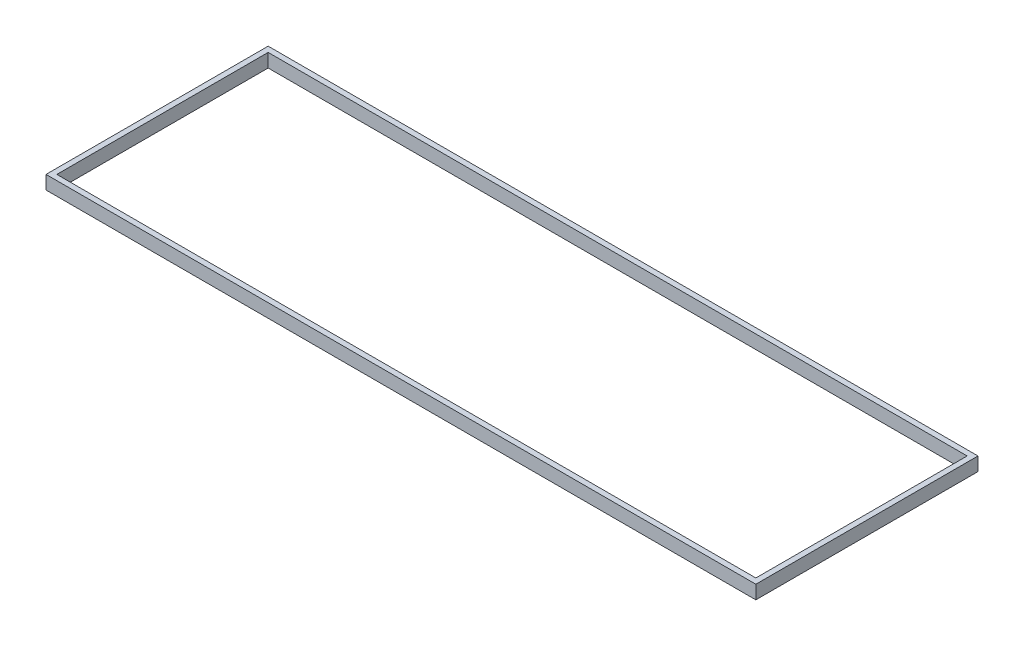
ISO-10303-21;
HEADER;
FILE_DESCRIPTION(('STEP AP214'),'2;1');
FILE_NAME('part.step','',(''),(''),'','','');
FILE_SCHEMA(('AUTOMOTIVE_DESIGN { 1 0 10303 214 1 1 1 1 }'));
ENDSEC;
DATA;
#1=APPLICATION_CONTEXT('core data for automotive mechanical design processes');
#2=APPLICATION_PROTOCOL_DEFINITION('international standard','automotive_design',2000,#1);
#3=PRODUCT_CONTEXT('',#1,'mechanical');
#4=PRODUCT('Part','Part','',(#3));
#5=PRODUCT_RELATED_PRODUCT_CATEGORY('part','',(#4));
#6=PRODUCT_DEFINITION_FORMATION('','',#4);
#7=PRODUCT_DEFINITION_CONTEXT('part definition',#1,'design');
#8=PRODUCT_DEFINITION('design','',#6,#7);
#9=PRODUCT_DEFINITION_SHAPE('','',#8);
#10=(LENGTH_UNIT() NAMED_UNIT(*) SI_UNIT(.MILLI.,.METRE.));
#11=(NAMED_UNIT(*) PLANE_ANGLE_UNIT() SI_UNIT($,.RADIAN.));
#12=(NAMED_UNIT(*) SI_UNIT($,.STERADIAN.) SOLID_ANGLE_UNIT());
#13=UNCERTAINTY_MEASURE_WITH_UNIT(LENGTH_MEASURE(1.E-05),#10,'distance_accuracy_value','');
#14=(GEOMETRIC_REPRESENTATION_CONTEXT(3) GLOBAL_UNCERTAINTY_ASSIGNED_CONTEXT((#13)) GLOBAL_UNIT_ASSIGNED_CONTEXT((#10,
#11,#12)) REPRESENTATION_CONTEXT('',''));
#15=CARTESIAN_POINT('',(0.,0.,0.));
#16=DIRECTION('',(0.,0.,1.));
#17=DIRECTION('',(1.,0.,0.));
#18=AXIS2_PLACEMENT_3D('',#15,#16,#17);
#19=CARTESIAN_POINT('',(0.,5.,0.));
#20=DIRECTION('',(0.,-1.,0.));
#21=DIRECTION('',(0.,0.,-1.));
#22=AXIS2_PLACEMENT_3D('',#19,#20,#21);
#23=PLANE('',#22);
#24=DIRECTION('',(0.,0.,1.));
#25=VECTOR('',#24,1.);
#26=CARTESIAN_POINT('',(0.,5.,0.));
#27=LINE('',#26,#25);
#28=CARTESIAN_POINT('',(0.,5.,-82.));
#29=VERTEX_POINT('',#28);
#30=CARTESIAN_POINT('',(0.,5.,0.));
#31=VERTEX_POINT('',#30);
#32=EDGE_CURVE('E134',#29,#31,#27,.T.);
#33=ORIENTED_EDGE('',*,*,#32,.T.);
#34=DIRECTION('',(1.,0.,0.));
#35=VECTOR('',#34,1.);
#36=CARTESIAN_POINT('',(0.,5.,0.));
#37=LINE('',#36,#35);
#38=CARTESIAN_POINT('',(262.,5.,0.));
#39=VERTEX_POINT('',#38);
#40=EDGE_CURVE('E137',#31,#39,#37,.T.);
#41=ORIENTED_EDGE('',*,*,#40,.T.);
#42=DIRECTION('',(0.,0.,-1.));
#43=VECTOR('',#42,1.);
#44=CARTESIAN_POINT('',(262.,5.,0.));
#45=LINE('',#44,#43);
#46=CARTESIAN_POINT('',(262.,5.,-82.));
#47=VERTEX_POINT('',#46);
#48=EDGE_CURVE('E140',#39,#47,#45,.T.);
#49=ORIENTED_EDGE('',*,*,#48,.T.);
#50=DIRECTION('',(-1.,0.,0.));
#51=VECTOR('',#50,1.);
#52=CARTESIAN_POINT('',(0.,5.,-82.));
#53=LINE('',#52,#51);
#54=EDGE_CURVE('E142',#47,#29,#53,.T.);
#55=ORIENTED_EDGE('',*,*,#54,.T.);
#56=EDGE_LOOP('',(#33,#41,#49,#55));
#57=FACE_BOUND('',#56,.T.);
#58=DIRECTION('',(0.,0.,1.));
#59=VECTOR('',#58,1.);
#60=CARTESIAN_POINT('',(2.,5.,-2.));
#61=LINE('',#60,#59);
#62=CARTESIAN_POINT('',(2.,5.,-80.));
#63=VERTEX_POINT('',#62);
#64=CARTESIAN_POINT('',(2.,5.,-2.));
#65=VERTEX_POINT('',#64);
#66=EDGE_CURVE('E98',#63,#65,#61,.T.);
#67=ORIENTED_EDGE('',*,*,#66,.F.);
#68=DIRECTION('',(-1.,0.,0.));
#69=VECTOR('',#68,1.);
#70=CARTESIAN_POINT('',(2.,5.,-80.));
#71=LINE('',#70,#69);
#72=CARTESIAN_POINT('',(260.,5.,-80.));
#73=VERTEX_POINT('',#72);
#74=EDGE_CURVE('E120',#73,#63,#71,.T.);
#75=ORIENTED_EDGE('',*,*,#74,.F.);
#76=DIRECTION('',(0.,0.,-1.));
#77=VECTOR('',#76,1.);
#78=CARTESIAN_POINT('',(260.,5.,-2.));
#79=LINE('',#78,#77);
#80=CARTESIAN_POINT('',(260.,5.,-2.));
#81=VERTEX_POINT('',#80);
#82=EDGE_CURVE('E118',#81,#73,#79,.T.);
#83=ORIENTED_EDGE('',*,*,#82,.F.);
#84=DIRECTION('',(1.,0.,0.));
#85=VECTOR('',#84,1.);
#86=CARTESIAN_POINT('',(2.,5.,-2.));
#87=LINE('',#86,#85);
#88=EDGE_CURVE('E106',#65,#81,#87,.T.);
#89=ORIENTED_EDGE('',*,*,#88,.F.);
#90=EDGE_LOOP('',(#67,#75,#83,#89));
#91=FACE_BOUND('',#90,.T.);
#92=ADVANCED_FACE('F33',(#57,#91),#23,.F.);
#93=CARTESIAN_POINT('',(0.,0.,0.));
#94=DIRECTION('',(0.,-1.,0.));
#95=DIRECTION('',(0.,0.,-1.));
#96=AXIS2_PLACEMENT_3D('',#93,#94,#95);
#97=PLANE('',#96);
#98=DIRECTION('',(0.,0.,1.));
#99=VECTOR('',#98,1.);
#100=CARTESIAN_POINT('',(0.,0.,0.));
#101=LINE('',#100,#99);
#102=CARTESIAN_POINT('',(0.,0.,-82.));
#103=VERTEX_POINT('',#102);
#104=CARTESIAN_POINT('',(0.,0.,0.));
#105=VERTEX_POINT('',#104);
#106=EDGE_CURVE('E114',#103,#105,#101,.T.);
#107=ORIENTED_EDGE('',*,*,#106,.F.);
#108=DIRECTION('',(-1.,0.,0.));
#109=VECTOR('',#108,1.);
#110=CARTESIAN_POINT('',(0.,0.,-82.));
#111=LINE('',#110,#109);
#112=CARTESIAN_POINT('',(262.,0.,-82.));
#113=VERTEX_POINT('',#112);
#114=EDGE_CURVE('E138',#113,#103,#111,.T.);
#115=ORIENTED_EDGE('',*,*,#114,.F.);
#116=DIRECTION('',(0.,0.,-1.));
#117=VECTOR('',#116,1.);
#118=CARTESIAN_POINT('',(262.,0.,0.));
#119=LINE('',#118,#117);
#120=CARTESIAN_POINT('',(262.,0.,0.));
#121=VERTEX_POINT('',#120);
#122=EDGE_CURVE('E149',#121,#113,#119,.T.);
#123=ORIENTED_EDGE('',*,*,#122,.F.);
#124=DIRECTION('',(1.,0.,0.));
#125=VECTOR('',#124,1.);
#126=CARTESIAN_POINT('',(0.,0.,0.));
#127=LINE('',#126,#125);
#128=EDGE_CURVE('E147',#105,#121,#127,.T.);
#129=ORIENTED_EDGE('',*,*,#128,.F.);
#130=EDGE_LOOP('',(#107,#115,#123,#129));
#131=FACE_BOUND('',#130,.T.);
#132=DIRECTION('',(-1.,0.,0.));
#133=VECTOR('',#132,1.);
#134=CARTESIAN_POINT('',(2.,0.,-80.));
#135=LINE('',#134,#133);
#136=CARTESIAN_POINT('',(260.,0.,-80.));
#137=VERTEX_POINT('',#136);
#138=CARTESIAN_POINT('',(2.,0.,-80.));
#139=VERTEX_POINT('',#138);
#140=EDGE_CURVE('E107',#137,#139,#135,.T.);
#141=ORIENTED_EDGE('',*,*,#140,.T.);
#142=DIRECTION('',(0.,0.,1.));
#143=VECTOR('',#142,1.);
#144=CARTESIAN_POINT('',(2.,0.,-2.));
#145=LINE('',#144,#143);
#146=CARTESIAN_POINT('',(2.,0.,-2.));
#147=VERTEX_POINT('',#146);
#148=EDGE_CURVE('E56',#139,#147,#145,.T.);
#149=ORIENTED_EDGE('',*,*,#148,.T.);
#150=DIRECTION('',(1.,0.,0.));
#151=VECTOR('',#150,1.);
#152=CARTESIAN_POINT('',(2.,0.,-2.));
#153=LINE('',#152,#151);
#154=CARTESIAN_POINT('',(260.,0.,-2.));
#155=VERTEX_POINT('',#154);
#156=EDGE_CURVE('E113',#147,#155,#153,.T.);
#157=ORIENTED_EDGE('',*,*,#156,.T.);
#158=DIRECTION('',(0.,0.,-1.));
#159=VECTOR('',#158,1.);
#160=CARTESIAN_POINT('',(260.,0.,-2.));
#161=LINE('',#160,#159);
#162=EDGE_CURVE('E126',#155,#137,#161,.T.);
#163=ORIENTED_EDGE('',*,*,#162,.T.);
#164=EDGE_LOOP('',(#141,#149,#157,#163));
#165=FACE_BOUND('',#164,.T.);
#166=ADVANCED_FACE('F167',(#131,#165),#97,.T.);
#167=CARTESIAN_POINT('',(0.,5.,0.));
#168=DIRECTION('',(1.,0.,0.));
#169=DIRECTION('',(0.,0.,-1.));
#170=AXIS2_PLACEMENT_3D('',#167,#168,#169);
#171=PLANE('',#170);
#172=ORIENTED_EDGE('',*,*,#106,.T.);
#173=DIRECTION('',(0.,-1.,0.));
#174=VECTOR('',#173,1.);
#175=CARTESIAN_POINT('',(0.,5.,0.));
#176=LINE('',#175,#174);
#177=EDGE_CURVE('E11',#31,#105,#176,.T.);
#178=ORIENTED_EDGE('',*,*,#177,.F.);
#179=ORIENTED_EDGE('',*,*,#32,.F.);
#180=DIRECTION('',(0.,-1.,0.));
#181=VECTOR('',#180,1.);
#182=CARTESIAN_POINT('',(0.,5.,-82.));
#183=LINE('',#182,#181);
#184=EDGE_CURVE('E144',#29,#103,#183,.T.);
#185=ORIENTED_EDGE('',*,*,#184,.T.);
#186=EDGE_LOOP('',(#172,#178,#179,#185));
#187=FACE_BOUND('',#186,.T.);
#188=ADVANCED_FACE('F35',(#187),#171,.F.);
#189=CARTESIAN_POINT('',(0.,5.,0.));
#190=DIRECTION('',(0.,0.,-1.));
#191=DIRECTION('',(-1.,0.,0.));
#192=AXIS2_PLACEMENT_3D('',#189,#190,#191);
#193=PLANE('',#192);
#194=ORIENTED_EDGE('',*,*,#128,.T.);
#195=DIRECTION('',(0.,-1.,0.));
#196=VECTOR('',#195,1.);
#197=CARTESIAN_POINT('',(262.,5.,0.));
#198=LINE('',#197,#196);
#199=EDGE_CURVE('E41',#39,#121,#198,.T.);
#200=ORIENTED_EDGE('',*,*,#199,.F.);
#201=ORIENTED_EDGE('',*,*,#40,.F.);
#202=ORIENTED_EDGE('',*,*,#177,.T.);
#203=EDGE_LOOP('',(#194,#200,#201,#202));
#204=FACE_BOUND('',#203,.T.);
#205=ADVANCED_FACE('F177',(#204),#193,.F.);
#206=CARTESIAN_POINT('',(262.,5.,0.));
#207=DIRECTION('',(-1.,0.,0.));
#208=DIRECTION('',(0.,0.,1.));
#209=AXIS2_PLACEMENT_3D('',#206,#207,#208);
#210=PLANE('',#209);
#211=ORIENTED_EDGE('',*,*,#122,.T.);
#212=DIRECTION('',(0.,-1.,0.));
#213=VECTOR('',#212,1.);
#214=CARTESIAN_POINT('',(262.,5.,-82.));
#215=LINE('',#214,#213);
#216=EDGE_CURVE('E154',#47,#113,#215,.T.);
#217=ORIENTED_EDGE('',*,*,#216,.F.);
#218=ORIENTED_EDGE('',*,*,#48,.F.);
#219=ORIENTED_EDGE('',*,*,#199,.T.);
#220=EDGE_LOOP('',(#211,#217,#218,#219));
#221=FACE_BOUND('',#220,.T.);
#222=ADVANCED_FACE('F161',(#221),#210,.F.);
#223=CARTESIAN_POINT('',(0.,5.,-82.));
#224=DIRECTION('',(0.,0.,1.));
#225=DIRECTION('',(1.,0.,0.));
#226=AXIS2_PLACEMENT_3D('',#223,#224,#225);
#227=PLANE('',#226);
#228=ORIENTED_EDGE('',*,*,#114,.T.);
#229=ORIENTED_EDGE('',*,*,#184,.F.);
#230=ORIENTED_EDGE('',*,*,#54,.F.);
#231=ORIENTED_EDGE('',*,*,#216,.T.);
#232=EDGE_LOOP('',(#228,#229,#230,#231));
#233=FACE_BOUND('',#232,.T.);
#234=ADVANCED_FACE('F171',(#233),#227,.F.);
#235=CARTESIAN_POINT('',(2.,5.,-2.));
#236=DIRECTION('',(1.,0.,0.));
#237=DIRECTION('',(0.,0.,-1.));
#238=AXIS2_PLACEMENT_3D('',#235,#236,#237);
#239=PLANE('',#238);
#240=ORIENTED_EDGE('',*,*,#148,.F.);
#241=DIRECTION('',(0.,-1.,0.));
#242=VECTOR('',#241,1.);
#243=CARTESIAN_POINT('',(2.,5.,-80.));
#244=LINE('',#243,#242);
#245=EDGE_CURVE('E102',#63,#139,#244,.T.);
#246=ORIENTED_EDGE('',*,*,#245,.F.);
#247=ORIENTED_EDGE('',*,*,#66,.T.);
#248=DIRECTION('',(0.,-1.,0.));
#249=VECTOR('',#248,1.);
#250=CARTESIAN_POINT('',(2.,5.,-2.));
#251=LINE('',#250,#249);
#252=EDGE_CURVE('E101',#65,#147,#251,.T.);
#253=ORIENTED_EDGE('',*,*,#252,.T.);
#254=EDGE_LOOP('',(#240,#246,#247,#253));
#255=FACE_BOUND('',#254,.T.);
#256=ADVANCED_FACE('F100',(#255),#239,.T.);
#257=CARTESIAN_POINT('',(2.,5.,-2.));
#258=DIRECTION('',(0.,0.,-1.));
#259=DIRECTION('',(-1.,0.,0.));
#260=AXIS2_PLACEMENT_3D('',#257,#258,#259);
#261=PLANE('',#260);
#262=ORIENTED_EDGE('',*,*,#156,.F.);
#263=ORIENTED_EDGE('',*,*,#252,.F.);
#264=ORIENTED_EDGE('',*,*,#88,.T.);
#265=DIRECTION('',(0.,-1.,0.));
#266=VECTOR('',#265,1.);
#267=CARTESIAN_POINT('',(260.,5.,-2.));
#268=LINE('',#267,#266);
#269=EDGE_CURVE('E115',#81,#155,#268,.T.);
#270=ORIENTED_EDGE('',*,*,#269,.T.);
#271=EDGE_LOOP('',(#262,#263,#264,#270));
#272=FACE_BOUND('',#271,.T.);
#273=ADVANCED_FACE('F110',(#272),#261,.T.);
#274=CARTESIAN_POINT('',(260.,5.,-2.));
#275=DIRECTION('',(-1.,0.,0.));
#276=DIRECTION('',(0.,0.,1.));
#277=AXIS2_PLACEMENT_3D('',#274,#275,#276);
#278=PLANE('',#277);
#279=ORIENTED_EDGE('',*,*,#162,.F.);
#280=ORIENTED_EDGE('',*,*,#269,.F.);
#281=ORIENTED_EDGE('',*,*,#82,.T.);
#282=DIRECTION('',(0.,-1.,0.));
#283=VECTOR('',#282,1.);
#284=CARTESIAN_POINT('',(260.,5.,-80.));
#285=LINE('',#284,#283);
#286=EDGE_CURVE('E48',#73,#137,#285,.T.);
#287=ORIENTED_EDGE('',*,*,#286,.T.);
#288=EDGE_LOOP('',(#279,#280,#281,#287));
#289=FACE_BOUND('',#288,.T.);
#290=ADVANCED_FACE('F200',(#289),#278,.T.);
#291=CARTESIAN_POINT('',(2.,5.,-80.));
#292=DIRECTION('',(0.,0.,1.));
#293=DIRECTION('',(1.,0.,0.));
#294=AXIS2_PLACEMENT_3D('',#291,#292,#293);
#295=PLANE('',#294);
#296=ORIENTED_EDGE('',*,*,#140,.F.);
#297=ORIENTED_EDGE('',*,*,#286,.F.);
#298=ORIENTED_EDGE('',*,*,#74,.T.);
#299=ORIENTED_EDGE('',*,*,#245,.T.);
#300=EDGE_LOOP('',(#296,#297,#298,#299));
#301=FACE_BOUND('',#300,.T.);
#302=ADVANCED_FACE('F204',(#301),#295,.T.);
#303=CLOSED_SHELL('',(#92,#166,#188,#205,#222,#234,#256,#273,#290,#302));
#304=MANIFOLD_SOLID_BREP('B2',#303);
#305=ADVANCED_BREP_SHAPE_REPRESENTATION('',(#18,#304),#14);
#306=SHAPE_DEFINITION_REPRESENTATION(#9,#305);
ENDSEC;
END-ISO-10303-21;
